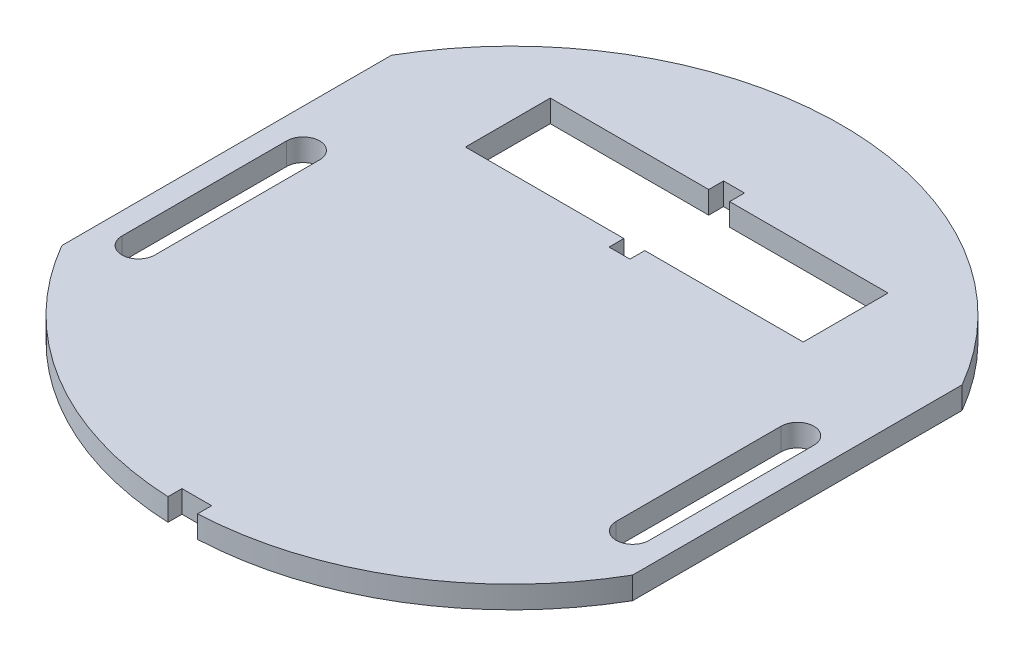
ISO-10303-21;
HEADER;
FILE_DESCRIPTION(('STEP AP214'),'2;1');
FILE_NAME('part.step','',(''),(''),'','','');
FILE_SCHEMA(('AUTOMOTIVE_DESIGN { 1 0 10303 214 1 1 1 1 }'));
ENDSEC;
DATA;
#1=APPLICATION_CONTEXT('core data for automotive mechanical design processes');
#2=APPLICATION_PROTOCOL_DEFINITION('international standard','automotive_design',2000,#1);
#3=PRODUCT_CONTEXT('',#1,'mechanical');
#4=PRODUCT('Part','Part','',(#3));
#5=PRODUCT_RELATED_PRODUCT_CATEGORY('part','',(#4));
#6=PRODUCT_DEFINITION_FORMATION('','',#4);
#7=PRODUCT_DEFINITION_CONTEXT('part definition',#1,'design');
#8=PRODUCT_DEFINITION('design','',#6,#7);
#9=PRODUCT_DEFINITION_SHAPE('','',#8);
#10=(LENGTH_UNIT() NAMED_UNIT(*) SI_UNIT(.MILLI.,.METRE.));
#11=(NAMED_UNIT(*) PLANE_ANGLE_UNIT() SI_UNIT($,.RADIAN.));
#12=(NAMED_UNIT(*) SI_UNIT($,.STERADIAN.) SOLID_ANGLE_UNIT());
#13=UNCERTAINTY_MEASURE_WITH_UNIT(LENGTH_MEASURE(1.E-05),#10,'distance_accuracy_value','');
#14=(GEOMETRIC_REPRESENTATION_CONTEXT(3) GLOBAL_UNCERTAINTY_ASSIGNED_CONTEXT((#13)) GLOBAL_UNIT_ASSIGNED_CONTEXT((#10,
#11,#12)) REPRESENTATION_CONTEXT('',''));
#15=CARTESIAN_POINT('',(0.,0.,0.));
#16=DIRECTION('',(0.,0.,1.));
#17=DIRECTION('',(1.,0.,0.));
#18=AXIS2_PLACEMENT_3D('',#15,#16,#17);
#19=CARTESIAN_POINT('',(0.,2.7,0.));
#20=DIRECTION('',(0.,-1.,0.));
#21=DIRECTION('',(0.,0.,-1.));
#22=AXIS2_PLACEMENT_3D('',#19,#20,#21);
#23=CYLINDRICAL_SURFACE('',#22,40.);
#24=DIRECTION('',(0.,-1.,0.));
#25=VECTOR('',#24,1.);
#26=CARTESIAN_POINT('',(1.79999999999999,138.405611065619,39.9594794760893));
#27=LINE('',#26,#25);
#28=CARTESIAN_POINT('',(1.79999999999999,2.7,39.9594794760893));
#29=VERTEX_POINT('',#28);
#30=CARTESIAN_POINT('',(1.79999999999999,0.,39.9594794760893));
#31=VERTEX_POINT('',#30);
#32=EDGE_CURVE('E240',#29,#31,#27,.T.);
#33=ORIENTED_EDGE('',*,*,#32,.T.);
#34=CARTESIAN_POINT('',(0.,0.,0.));
#35=DIRECTION('',(0.,1.,0.));
#36=DIRECTION('',(0.,0.,1.));
#37=AXIS2_PLACEMENT_3D('',#34,#35,#36);
#38=CIRCLE('',#37,40.);
#39=CARTESIAN_POINT('',(34.6410161513776,0.,19.9999999999999));
#40=VERTEX_POINT('',#39);
#41=EDGE_CURVE('E422',#31,#40,#38,.T.);
#42=ORIENTED_EDGE('',*,*,#41,.T.);
#43=DIRECTION('',(0.,-1.,0.));
#44=VECTOR('',#43,1.);
#45=CARTESIAN_POINT('',(34.6410161513776,2.7,19.9999999999999));
#46=LINE('',#45,#44);
#47=CARTESIAN_POINT('',(34.6410161513776,2.7,19.9999999999999));
#48=VERTEX_POINT('',#47);
#49=EDGE_CURVE('E428',#48,#40,#46,.T.);
#50=ORIENTED_EDGE('',*,*,#49,.F.);
#51=CARTESIAN_POINT('',(0.,2.7,0.));
#52=DIRECTION('',(0.,1.,0.));
#53=DIRECTION('',(0.,0.,1.));
#54=AXIS2_PLACEMENT_3D('',#51,#52,#53);
#55=CIRCLE('',#54,40.);
#56=EDGE_CURVE('E412',#29,#48,#55,.T.);
#57=ORIENTED_EDGE('',*,*,#56,.F.);
#58=EDGE_LOOP('',(#33,#42,#50,#57));
#59=FACE_BOUND('',#58,.T.);
#60=ADVANCED_FACE('F33',(#59),#23,.T.);
#61=DIRECTION('',(0.,-1.,0.));
#62=VECTOR('',#61,1.);
#63=CARTESIAN_POINT('',(-1.80000000000001,138.405611065619,39.9594794760893));
#64=LINE('',#63,#62);
#65=CARTESIAN_POINT('',(-1.80000000000001,2.7,39.9594794760893));
#66=VERTEX_POINT('',#65);
#67=CARTESIAN_POINT('',(-1.80000000000001,0.,39.9594794760893));
#68=VERTEX_POINT('',#67);
#69=EDGE_CURVE('E231',#66,#68,#64,.T.);
#70=ORIENTED_EDGE('',*,*,#69,.F.);
#71=CARTESIAN_POINT('',(-34.6410161513776,2.7,19.9999999999999));
#72=VERTEX_POINT('',#71);
#73=EDGE_CURVE('E413',#72,#66,#55,.T.);
#74=ORIENTED_EDGE('',*,*,#73,.F.);
#75=DIRECTION('',(0.,-1.,0.));
#76=VECTOR('',#75,1.);
#77=CARTESIAN_POINT('',(-34.6410161513776,2.7,19.9999999999999));
#78=LINE('',#77,#76);
#79=CARTESIAN_POINT('',(-34.6410161513776,0.,19.9999999999999));
#80=VERTEX_POINT('',#79);
#81=EDGE_CURVE('E431',#72,#80,#78,.T.);
#82=ORIENTED_EDGE('',*,*,#81,.T.);
#83=EDGE_CURVE('E423',#80,#68,#38,.T.);
#84=ORIENTED_EDGE('',*,*,#83,.T.);
#85=EDGE_LOOP('',(#70,#74,#82,#84));
#86=FACE_BOUND('',#85,.T.);
#87=ADVANCED_FACE('F445',(#86),#23,.T.);
#88=CARTESIAN_POINT('',(0.,2.7,0.));
#89=DIRECTION('',(0.,1.,0.));
#90=DIRECTION('',(0.,0.,1.));
#91=AXIS2_PLACEMENT_3D('',#88,#89,#90);
#92=PLANE('',#91);
#93=CARTESIAN_POINT('',(-30.,2.7,-4.65));
#94=DIRECTION('',(0.,1.,0.));
#95=DIRECTION('',(0.,0.,1.));
#96=AXIS2_PLACEMENT_3D('',#93,#94,#95);
#97=CIRCLE('',#96,2.);
#98=CARTESIAN_POINT('',(-28.,2.7,-4.65));
#99=VERTEX_POINT('',#98);
#100=CARTESIAN_POINT('',(-32.,2.7,-4.65));
#101=VERTEX_POINT('',#100);
#102=EDGE_CURVE('E382',#99,#101,#97,.T.);
#103=ORIENTED_EDGE('',*,*,#102,.F.);
#104=DIRECTION('',(0.,0.,-1.));
#105=VECTOR('',#104,1.);
#106=CARTESIAN_POINT('',(-28.,2.7,-4.65));
#107=LINE('',#106,#105);
#108=CARTESIAN_POINT('',(-28.,2.7,15.35));
#109=VERTEX_POINT('',#108);
#110=EDGE_CURVE('E390',#109,#99,#107,.T.);
#111=ORIENTED_EDGE('',*,*,#110,.F.);
#112=CARTESIAN_POINT('',(-30.,2.7,15.35));
#113=DIRECTION('',(0.,1.,0.));
#114=DIRECTION('',(0.,0.,1.));
#115=AXIS2_PLACEMENT_3D('',#112,#113,#114);
#116=CIRCLE('',#115,2.);
#117=CARTESIAN_POINT('',(-32.,2.7,15.35));
#118=VERTEX_POINT('',#117);
#119=EDGE_CURVE('E387',#118,#109,#116,.T.);
#120=ORIENTED_EDGE('',*,*,#119,.F.);
#121=DIRECTION('',(0.,0.,1.));
#122=VECTOR('',#121,1.);
#123=CARTESIAN_POINT('',(-32.,2.7,-4.65));
#124=LINE('',#123,#122);
#125=EDGE_CURVE('E384',#101,#118,#124,.T.);
#126=ORIENTED_EDGE('',*,*,#125,.F.);
#127=EDGE_LOOP('',(#103,#111,#120,#126));
#128=FACE_BOUND('',#127,.T.);
#129=DIRECTION('',(0.,0.,1.));
#130=VECTOR('',#129,1.);
#131=CARTESIAN_POINT('',(-1.27,2.7,-26.9499999999999));
#132=LINE('',#131,#130);
#133=CARTESIAN_POINT('',(-1.27,2.7,-26.9499999999999));
#134=VERTEX_POINT('',#133);
#135=CARTESIAN_POINT('',(-1.27,2.7,-25.1499999999999));
#136=VERTEX_POINT('',#135);
#137=EDGE_CURVE('E311',#134,#136,#132,.T.);
#138=ORIENTED_EDGE('',*,*,#137,.F.);
#139=DIRECTION('',(-1.,0.,0.));
#140=VECTOR('',#139,1.);
#141=CARTESIAN_POINT('',(-1.27,2.7,-26.9499999999999));
#142=LINE('',#141,#140);
#143=CARTESIAN_POINT('',(1.27,2.7,-26.9499999999999));
#144=VERTEX_POINT('',#143);
#145=EDGE_CURVE('E343',#144,#134,#142,.T.);
#146=ORIENTED_EDGE('',*,*,#145,.F.);
#147=DIRECTION('',(0.,0.,-1.));
#148=VECTOR('',#147,1.);
#149=CARTESIAN_POINT('',(1.27,2.7,-26.9499999999999));
#150=LINE('',#149,#148);
#151=CARTESIAN_POINT('',(1.27,2.7,-25.1499999999999));
#152=VERTEX_POINT('',#151);
#153=EDGE_CURVE('E340',#152,#144,#150,.T.);
#154=ORIENTED_EDGE('',*,*,#153,.F.);
#155=DIRECTION('',(-1.,0.,0.));
#156=VECTOR('',#155,1.);
#157=CARTESIAN_POINT('',(1.27,2.7,-25.1499999999999));
#158=LINE('',#157,#156);
#159=CARTESIAN_POINT('',(20.5,2.7,-25.1499999999999));
#160=VERTEX_POINT('',#159);
#161=EDGE_CURVE('E337',#160,#152,#158,.T.);
#162=ORIENTED_EDGE('',*,*,#161,.F.);
#163=DIRECTION('',(0.,0.,-1.));
#164=VECTOR('',#163,1.);
#165=CARTESIAN_POINT('',(20.5,2.7,-25.1499999999999));
#166=LINE('',#165,#164);
#167=CARTESIAN_POINT('',(20.5,2.7,-14.8499999999999));
#168=VERTEX_POINT('',#167);
#169=EDGE_CURVE('E334',#168,#160,#166,.T.);
#170=ORIENTED_EDGE('',*,*,#169,.F.);
#171=DIRECTION('',(1.,0.,0.));
#172=VECTOR('',#171,1.);
#173=CARTESIAN_POINT('',(1.27,2.7,-14.8499999999999));
#174=LINE('',#173,#172);
#175=CARTESIAN_POINT('',(1.27,2.7,-14.8499999999999));
#176=VERTEX_POINT('',#175);
#177=EDGE_CURVE('E331',#176,#168,#174,.T.);
#178=ORIENTED_EDGE('',*,*,#177,.F.);
#179=DIRECTION('',(0.,0.,-1.));
#180=VECTOR('',#179,1.);
#181=CARTESIAN_POINT('',(1.27,2.7,-14.8499999999999));
#182=LINE('',#181,#180);
#183=CARTESIAN_POINT('',(1.27,2.7,-13.0499999999999));
#184=VERTEX_POINT('',#183);
#185=EDGE_CURVE('E328',#184,#176,#182,.T.);
#186=ORIENTED_EDGE('',*,*,#185,.F.);
#187=DIRECTION('',(1.,0.,0.));
#188=VECTOR('',#187,1.);
#189=CARTESIAN_POINT('',(-1.27,2.7,-13.0499999999999));
#190=LINE('',#189,#188);
#191=CARTESIAN_POINT('',(-1.27,2.7,-13.0499999999999));
#192=VERTEX_POINT('',#191);
#193=EDGE_CURVE('E325',#192,#184,#190,.T.);
#194=ORIENTED_EDGE('',*,*,#193,.F.);
#195=DIRECTION('',(0.,0.,1.));
#196=VECTOR('',#195,1.);
#197=CARTESIAN_POINT('',(-1.27,2.7,-14.8499999999999));
#198=LINE('',#197,#196);
#199=CARTESIAN_POINT('',(-1.27,2.7,-14.8499999999999));
#200=VERTEX_POINT('',#199);
#201=EDGE_CURVE('E322',#200,#192,#198,.T.);
#202=ORIENTED_EDGE('',*,*,#201,.F.);
#203=DIRECTION('',(1.,0.,0.));
#204=VECTOR('',#203,1.);
#205=CARTESIAN_POINT('',(-20.5,2.7,-14.8499999999999));
#206=LINE('',#205,#204);
#207=CARTESIAN_POINT('',(-20.5,2.7,-14.8499999999999));
#208=VERTEX_POINT('',#207);
#209=EDGE_CURVE('E319',#208,#200,#206,.T.);
#210=ORIENTED_EDGE('',*,*,#209,.F.);
#211=DIRECTION('',(0.,0.,1.));
#212=VECTOR('',#211,1.);
#213=CARTESIAN_POINT('',(-20.5,2.7,-25.1499999999999));
#214=LINE('',#213,#212);
#215=CARTESIAN_POINT('',(-20.5,2.7,-25.1499999999999));
#216=VERTEX_POINT('',#215);
#217=EDGE_CURVE('E316',#216,#208,#214,.T.);
#218=ORIENTED_EDGE('',*,*,#217,.F.);
#219=DIRECTION('',(-1.,0.,0.));
#220=VECTOR('',#219,1.);
#221=CARTESIAN_POINT('',(-20.5,2.7,-25.1499999999999));
#222=LINE('',#221,#220);
#223=EDGE_CURVE('E313',#136,#216,#222,.T.);
#224=ORIENTED_EDGE('',*,*,#223,.F.);
#225=EDGE_LOOP('',(#138,#146,#154,#162,#170,#178,#186,#194,#202,#210,#218,#224));
#226=FACE_BOUND('',#225,.T.);
#227=CARTESIAN_POINT('',(30.,2.7,-4.65));
#228=DIRECTION('',(0.,-1.,0.));
#229=DIRECTION('',(0.,0.,1.));
#230=AXIS2_PLACEMENT_3D('',#227,#228,#229);
#231=CIRCLE('',#230,2.);
#232=CARTESIAN_POINT('',(28.,2.7,-4.65));
#233=VERTEX_POINT('',#232);
#234=CARTESIAN_POINT('',(32.,2.7,-4.65));
#235=VERTEX_POINT('',#234);
#236=EDGE_CURVE('E276',#233,#235,#231,.T.);
#237=ORIENTED_EDGE('',*,*,#236,.T.);
#238=DIRECTION('',(0.,0.,1.));
#239=VECTOR('',#238,1.);
#240=CARTESIAN_POINT('',(32.,2.7,-4.65));
#241=LINE('',#240,#239);
#242=CARTESIAN_POINT('',(32.,2.7,15.35));
#243=VERTEX_POINT('',#242);
#244=EDGE_CURVE('E249',#235,#243,#241,.T.);
#245=ORIENTED_EDGE('',*,*,#244,.T.);
#246=CARTESIAN_POINT('',(30.,2.7,15.35));
#247=DIRECTION('',(0.,-1.,0.));
#248=DIRECTION('',(0.,0.,1.));
#249=AXIS2_PLACEMENT_3D('',#246,#247,#248);
#250=CIRCLE('',#249,2.);
#251=CARTESIAN_POINT('',(28.,2.7,15.35));
#252=VERTEX_POINT('',#251);
#253=EDGE_CURVE('E260',#243,#252,#250,.T.);
#254=ORIENTED_EDGE('',*,*,#253,.T.);
#255=DIRECTION('',(0.,0.,-1.));
#256=VECTOR('',#255,1.);
#257=CARTESIAN_POINT('',(28.,2.7,-4.65));
#258=LINE('',#257,#256);
#259=EDGE_CURVE('E268',#252,#233,#258,.T.);
#260=ORIENTED_EDGE('',*,*,#259,.T.);
#261=EDGE_LOOP('',(#237,#245,#254,#260));
#262=FACE_BOUND('',#261,.T.);
#263=DIRECTION('',(1.,0.,0.));
#264=VECTOR('',#263,1.);
#265=CARTESIAN_POINT('',(0.,2.7,38.2594794760893));
#266=LINE('',#265,#264);
#267=CARTESIAN_POINT('',(-1.80000000000001,2.7,38.2594794760893));
#268=VERTEX_POINT('',#267);
#269=CARTESIAN_POINT('',(1.79999999999999,2.7,38.2594794760893));
#270=VERTEX_POINT('',#269);
#271=EDGE_CURVE('E48',#268,#270,#266,.T.);
#272=ORIENTED_EDGE('',*,*,#271,.T.);
#273=DIRECTION('',(0.,0.,1.));
#274=VECTOR('',#273,1.);
#275=CARTESIAN_POINT('',(1.79999999999998,2.7,0.));
#276=LINE('',#275,#274);
#277=EDGE_CURVE('E244',#270,#29,#276,.T.);
#278=ORIENTED_EDGE('',*,*,#277,.T.);
#279=ORIENTED_EDGE('',*,*,#56,.T.);
#280=DIRECTION('',(0.,0.,-1.));
#281=VECTOR('',#280,1.);
#282=CARTESIAN_POINT('',(34.6410161513776,2.7,-19.9999999999999));
#283=LINE('',#282,#281);
#284=CARTESIAN_POINT('',(34.6410161513776,2.7,-19.9999999999999));
#285=VERTEX_POINT('',#284);
#286=EDGE_CURVE('E415',#48,#285,#283,.T.);
#287=ORIENTED_EDGE('',*,*,#286,.T.);
#288=CARTESIAN_POINT('',(0.,2.7,0.));
#289=DIRECTION('',(0.,1.,0.));
#290=DIRECTION('',(0.,0.,1.));
#291=AXIS2_PLACEMENT_3D('',#288,#289,#290);
#292=CIRCLE('',#291,40.);
#293=CARTESIAN_POINT('',(-34.6410161513776,2.7,-19.9999999999999));
#294=VERTEX_POINT('',#293);
#295=EDGE_CURVE('E406',#285,#294,#292,.T.);
#296=ORIENTED_EDGE('',*,*,#295,.T.);
#297=DIRECTION('',(0.,0.,1.));
#298=VECTOR('',#297,1.);
#299=CARTESIAN_POINT('',(-34.6410161513776,2.7,-19.9999999999999));
#300=LINE('',#299,#298);
#301=EDGE_CURVE('E409',#294,#72,#300,.T.);
#302=ORIENTED_EDGE('',*,*,#301,.T.);
#303=ORIENTED_EDGE('',*,*,#73,.T.);
#304=DIRECTION('',(0.,0.,-1.));
#305=VECTOR('',#304,1.);
#306=CARTESIAN_POINT('',(-1.8,2.7,0.));
#307=LINE('',#306,#305);
#308=EDGE_CURVE('E53',#66,#268,#307,.T.);
#309=ORIENTED_EDGE('',*,*,#308,.T.);
#310=EDGE_LOOP('',(#272,#278,#279,#287,#296,#302,#303,#309));
#311=FACE_BOUND('',#310,.T.);
#312=ADVANCED_FACE('F447',(#128,#226,#262,#311),#92,.T.);
#313=CARTESIAN_POINT('',(0.,0.,0.));
#314=DIRECTION('',(0.,1.,0.));
#315=DIRECTION('',(0.,0.,1.));
#316=AXIS2_PLACEMENT_3D('',#313,#314,#315);
#317=PLANE('',#316);
#318=DIRECTION('',(0.,0.,1.));
#319=VECTOR('',#318,1.);
#320=CARTESIAN_POINT('',(-28.,0.,-4.65));
#321=LINE('',#320,#319);
#322=CARTESIAN_POINT('',(-28.,0.,-4.65));
#323=VERTEX_POINT('',#322);
#324=CARTESIAN_POINT('',(-28.,0.,15.35));
#325=VERTEX_POINT('',#324);
#326=EDGE_CURVE('E376',#323,#325,#321,.T.);
#327=ORIENTED_EDGE('',*,*,#326,.F.);
#328=CARTESIAN_POINT('',(-30.,0.,-4.65));
#329=DIRECTION('',(0.,1.,0.));
#330=DIRECTION('',(0.,0.,1.));
#331=AXIS2_PLACEMENT_3D('',#328,#329,#330);
#332=CIRCLE('',#331,2.);
#333=CARTESIAN_POINT('',(-32.,0.,-4.65));
#334=VERTEX_POINT('',#333);
#335=EDGE_CURVE('E379',#334,#323,#332,.F.);
#336=ORIENTED_EDGE('',*,*,#335,.F.);
#337=DIRECTION('',(0.,0.,-1.));
#338=VECTOR('',#337,1.);
#339=CARTESIAN_POINT('',(-32.,0.,-4.65));
#340=LINE('',#339,#338);
#341=CARTESIAN_POINT('',(-32.,0.,15.35));
#342=VERTEX_POINT('',#341);
#343=EDGE_CURVE('E396',#342,#334,#340,.T.);
#344=ORIENTED_EDGE('',*,*,#343,.F.);
#345=CARTESIAN_POINT('',(-30.,0.,15.35));
#346=DIRECTION('',(0.,1.,0.));
#347=DIRECTION('',(0.,0.,1.));
#348=AXIS2_PLACEMENT_3D('',#345,#346,#347);
#349=CIRCLE('',#348,2.);
#350=EDGE_CURVE('E374',#325,#342,#349,.F.);
#351=ORIENTED_EDGE('',*,*,#350,.F.);
#352=EDGE_LOOP('',(#327,#336,#344,#351));
#353=FACE_BOUND('',#352,.T.);
#354=DIRECTION('',(1.,0.,0.));
#355=VECTOR('',#354,1.);
#356=CARTESIAN_POINT('',(-1.27,0.,-26.9499999999999));
#357=LINE('',#356,#355);
#358=CARTESIAN_POINT('',(-1.27,0.,-26.9499999999999));
#359=VERTEX_POINT('',#358);
#360=CARTESIAN_POINT('',(1.27,0.,-26.9499999999999));
#361=VERTEX_POINT('',#360);
#362=EDGE_CURVE('E305',#359,#361,#357,.T.);
#363=ORIENTED_EDGE('',*,*,#362,.F.);
#364=DIRECTION('',(0.,0.,-1.));
#365=VECTOR('',#364,1.);
#366=CARTESIAN_POINT('',(-1.27,0.,-26.9499999999999));
#367=LINE('',#366,#365);
#368=CARTESIAN_POINT('',(-1.27,0.,-25.1499999999999));
#369=VERTEX_POINT('',#368);
#370=EDGE_CURVE('E308',#369,#359,#367,.T.);
#371=ORIENTED_EDGE('',*,*,#370,.F.);
#372=DIRECTION('',(1.,0.,0.));
#373=VECTOR('',#372,1.);
#374=CARTESIAN_POINT('',(-20.5,0.,-25.1499999999999));
#375=LINE('',#374,#373);
#376=CARTESIAN_POINT('',(-20.5,0.,-25.1499999999999));
#377=VERTEX_POINT('',#376);
#378=EDGE_CURVE('E349',#377,#369,#375,.T.);
#379=ORIENTED_EDGE('',*,*,#378,.F.);
#380=DIRECTION('',(0.,0.,-1.));
#381=VECTOR('',#380,1.);
#382=CARTESIAN_POINT('',(-20.5,0.,-25.1499999999999));
#383=LINE('',#382,#381);
#384=CARTESIAN_POINT('',(-20.5,0.,-14.8499999999999));
#385=VERTEX_POINT('',#384);
#386=EDGE_CURVE('E279',#385,#377,#383,.T.);
#387=ORIENTED_EDGE('',*,*,#386,.F.);
#388=DIRECTION('',(-1.,0.,0.));
#389=VECTOR('',#388,1.);
#390=CARTESIAN_POINT('',(-20.5,0.,-14.8499999999999));
#391=LINE('',#390,#389);
#392=CARTESIAN_POINT('',(-1.27,0.,-14.8499999999999));
#393=VERTEX_POINT('',#392);
#394=EDGE_CURVE('E281',#393,#385,#391,.T.);
#395=ORIENTED_EDGE('',*,*,#394,.F.);
#396=DIRECTION('',(0.,0.,-1.));
#397=VECTOR('',#396,1.);
#398=CARTESIAN_POINT('',(-1.27,0.,-14.8499999999999));
#399=LINE('',#398,#397);
#400=CARTESIAN_POINT('',(-1.27,0.,-13.0499999999999));
#401=VERTEX_POINT('',#400);
#402=EDGE_CURVE('E284',#401,#393,#399,.T.);
#403=ORIENTED_EDGE('',*,*,#402,.F.);
#404=DIRECTION('',(-1.,0.,0.));
#405=VECTOR('',#404,1.);
#406=CARTESIAN_POINT('',(-1.27,0.,-13.0499999999999));
#407=LINE('',#406,#405);
#408=CARTESIAN_POINT('',(1.27,0.,-13.0499999999999));
#409=VERTEX_POINT('',#408);
#410=EDGE_CURVE('E287',#409,#401,#407,.T.);
#411=ORIENTED_EDGE('',*,*,#410,.F.);
#412=DIRECTION('',(0.,0.,1.));
#413=VECTOR('',#412,1.);
#414=CARTESIAN_POINT('',(1.27,0.,-14.8499999999999));
#415=LINE('',#414,#413);
#416=CARTESIAN_POINT('',(1.27,0.,-14.8499999999999));
#417=VERTEX_POINT('',#416);
#418=EDGE_CURVE('E290',#417,#409,#415,.T.);
#419=ORIENTED_EDGE('',*,*,#418,.F.);
#420=DIRECTION('',(-1.,0.,0.));
#421=VECTOR('',#420,1.);
#422=CARTESIAN_POINT('',(1.27,0.,-14.8499999999999));
#423=LINE('',#422,#421);
#424=CARTESIAN_POINT('',(20.5,0.,-14.8499999999999));
#425=VERTEX_POINT('',#424);
#426=EDGE_CURVE('E293',#425,#417,#423,.T.);
#427=ORIENTED_EDGE('',*,*,#426,.F.);
#428=DIRECTION('',(0.,0.,1.));
#429=VECTOR('',#428,1.);
#430=CARTESIAN_POINT('',(20.5,0.,-25.1499999999999));
#431=LINE('',#430,#429);
#432=CARTESIAN_POINT('',(20.5,0.,-25.1499999999999));
#433=VERTEX_POINT('',#432);
#434=EDGE_CURVE('E296',#433,#425,#431,.T.);
#435=ORIENTED_EDGE('',*,*,#434,.F.);
#436=DIRECTION('',(1.,0.,0.));
#437=VECTOR('',#436,1.);
#438=CARTESIAN_POINT('',(1.27,0.,-25.1499999999999));
#439=LINE('',#438,#437);
#440=CARTESIAN_POINT('',(1.27,0.,-25.1499999999999));
#441=VERTEX_POINT('',#440);
#442=EDGE_CURVE('E299',#441,#433,#439,.T.);
#443=ORIENTED_EDGE('',*,*,#442,.F.);
#444=DIRECTION('',(0.,0.,1.));
#445=VECTOR('',#444,1.);
#446=CARTESIAN_POINT('',(1.27,0.,-26.9499999999999));
#447=LINE('',#446,#445);
#448=EDGE_CURVE('E302',#361,#441,#447,.T.);
#449=ORIENTED_EDGE('',*,*,#448,.F.);
#450=EDGE_LOOP('',(#363,#371,#379,#387,#395,#403,#411,#419,#427,#435,#443,#449));
#451=FACE_BOUND('',#450,.T.);
#452=DIRECTION('',(0.,0.,-1.));
#453=VECTOR('',#452,1.);
#454=CARTESIAN_POINT('',(32.,0.,-4.65));
#455=LINE('',#454,#453);
#456=CARTESIAN_POINT('',(32.,0.,15.35));
#457=VERTEX_POINT('',#456);
#458=CARTESIAN_POINT('',(32.,0.,-4.65));
#459=VERTEX_POINT('',#458);
#460=EDGE_CURVE('E246',#457,#459,#455,.T.);
#461=ORIENTED_EDGE('',*,*,#460,.T.);
#462=CARTESIAN_POINT('',(30.,0.,-4.65));
#463=DIRECTION('',(0.,-1.,0.));
#464=DIRECTION('',(0.,0.,1.));
#465=AXIS2_PLACEMENT_3D('',#462,#463,#464);
#466=CIRCLE('',#465,2.);
#467=CARTESIAN_POINT('',(28.,0.,-4.65));
#468=VERTEX_POINT('',#467);
#469=EDGE_CURVE('E273',#459,#468,#466,.F.);
#470=ORIENTED_EDGE('',*,*,#469,.T.);
#471=DIRECTION('',(0.,0.,1.));
#472=VECTOR('',#471,1.);
#473=CARTESIAN_POINT('',(28.,0.,-4.65));
#474=LINE('',#473,#472);
#475=CARTESIAN_POINT('',(28.,0.,15.35));
#476=VERTEX_POINT('',#475);
#477=EDGE_CURVE('E265',#468,#476,#474,.T.);
#478=ORIENTED_EDGE('',*,*,#477,.T.);
#479=CARTESIAN_POINT('',(30.,0.,15.35));
#480=DIRECTION('',(0.,-1.,0.));
#481=DIRECTION('',(0.,0.,1.));
#482=AXIS2_PLACEMENT_3D('',#479,#480,#481);
#483=CIRCLE('',#482,2.);
#484=EDGE_CURVE('E257',#476,#457,#483,.F.);
#485=ORIENTED_EDGE('',*,*,#484,.T.);
#486=EDGE_LOOP('',(#461,#470,#478,#485));
#487=FACE_BOUND('',#486,.T.);
#488=DIRECTION('',(0.,0.,1.));
#489=VECTOR('',#488,1.);
#490=CARTESIAN_POINT('',(1.79999999999998,0.,0.));
#491=LINE('',#490,#489);
#492=CARTESIAN_POINT('',(1.79999999999999,0.,38.2594794760893));
#493=VERTEX_POINT('',#492);
#494=EDGE_CURVE('E11',#493,#31,#491,.T.);
#495=ORIENTED_EDGE('',*,*,#494,.F.);
#496=DIRECTION('',(1.,0.,0.));
#497=VECTOR('',#496,1.);
#498=CARTESIAN_POINT('',(0.,0.,38.2594794760893));
#499=LINE('',#498,#497);
#500=CARTESIAN_POINT('',(-1.80000000000001,0.,38.2594794760893));
#501=VERTEX_POINT('',#500);
#502=EDGE_CURVE('E41',#501,#493,#499,.T.);
#503=ORIENTED_EDGE('',*,*,#502,.F.);
#504=DIRECTION('',(0.,0.,-1.));
#505=VECTOR('',#504,1.);
#506=CARTESIAN_POINT('',(-1.8,0.,0.));
#507=LINE('',#506,#505);
#508=EDGE_CURVE('E219',#68,#501,#507,.T.);
#509=ORIENTED_EDGE('',*,*,#508,.F.);
#510=ORIENTED_EDGE('',*,*,#83,.F.);
#511=DIRECTION('',(0.,0.,1.));
#512=VECTOR('',#511,1.);
#513=CARTESIAN_POINT('',(-34.6410161513776,0.,-19.9999999999999));
#514=LINE('',#513,#512);
#515=CARTESIAN_POINT('',(-34.6410161513776,0.,-19.9999999999999));
#516=VERTEX_POINT('',#515);
#517=EDGE_CURVE('E420',#516,#80,#514,.T.);
#518=ORIENTED_EDGE('',*,*,#517,.F.);
#519=CARTESIAN_POINT('',(0.,0.,0.));
#520=DIRECTION('',(0.,1.,0.));
#521=DIRECTION('',(0.,0.,1.));
#522=AXIS2_PLACEMENT_3D('',#519,#520,#521);
#523=CIRCLE('',#522,40.);
#524=CARTESIAN_POINT('',(34.6410161513776,0.,-19.9999999999999));
#525=VERTEX_POINT('',#524);
#526=EDGE_CURVE('E405',#525,#516,#523,.T.);
#527=ORIENTED_EDGE('',*,*,#526,.F.);
#528=DIRECTION('',(0.,0.,-1.));
#529=VECTOR('',#528,1.);
#530=CARTESIAN_POINT('',(34.6410161513776,0.,-19.9999999999999));
#531=LINE('',#530,#529);
#532=EDGE_CURVE('E410',#40,#525,#531,.T.);
#533=ORIENTED_EDGE('',*,*,#532,.F.);
#534=ORIENTED_EDGE('',*,*,#41,.F.);
#535=EDGE_LOOP('',(#495,#503,#509,#510,#518,#527,#533,#534));
#536=FACE_BOUND('',#535,.T.);
#537=ADVANCED_FACE('F217',(#353,#451,#487,#536),#317,.F.);
#538=CARTESIAN_POINT('',(0.,2.7,0.));
#539=DIRECTION('',(0.,-1.,0.));
#540=DIRECTION('',(0.,0.,-1.));
#541=AXIS2_PLACEMENT_3D('',#538,#539,#540);
#542=CYLINDRICAL_SURFACE('',#541,40.);
#543=ORIENTED_EDGE('',*,*,#526,.T.);
#544=DIRECTION('',(0.,-1.,0.));
#545=VECTOR('',#544,1.);
#546=CARTESIAN_POINT('',(-34.6410161513776,2.7,-19.9999999999999));
#547=LINE('',#546,#545);
#548=EDGE_CURVE('E232',#294,#516,#547,.T.);
#549=ORIENTED_EDGE('',*,*,#548,.F.);
#550=ORIENTED_EDGE('',*,*,#295,.F.);
#551=DIRECTION('',(0.,-1.,0.));
#552=VECTOR('',#551,1.);
#553=CARTESIAN_POINT('',(34.6410161513776,2.7,-19.9999999999999));
#554=LINE('',#553,#552);
#555=EDGE_CURVE('E417',#285,#525,#554,.T.);
#556=ORIENTED_EDGE('',*,*,#555,.T.);
#557=EDGE_LOOP('',(#543,#549,#550,#556));
#558=FACE_BOUND('',#557,.T.);
#559=ADVANCED_FACE('F35',(#558),#542,.T.);
#560=CARTESIAN_POINT('',(-34.6410161513776,2.7,-19.9999999999999));
#561=DIRECTION('',(1.,0.,0.));
#562=DIRECTION('',(0.,0.,-1.));
#563=AXIS2_PLACEMENT_3D('',#560,#561,#562);
#564=PLANE('',#563);
#565=ORIENTED_EDGE('',*,*,#517,.T.);
#566=ORIENTED_EDGE('',*,*,#81,.F.);
#567=ORIENTED_EDGE('',*,*,#301,.F.);
#568=ORIENTED_EDGE('',*,*,#548,.T.);
#569=EDGE_LOOP('',(#565,#566,#567,#568));
#570=FACE_BOUND('',#569,.T.);
#571=ADVANCED_FACE('F437',(#570),#564,.F.);
#572=CARTESIAN_POINT('',(34.6410161513776,2.7,-19.9999999999999));
#573=DIRECTION('',(-1.,0.,0.));
#574=DIRECTION('',(0.,0.,1.));
#575=AXIS2_PLACEMENT_3D('',#572,#573,#574);
#576=PLANE('',#575);
#577=ORIENTED_EDGE('',*,*,#532,.T.);
#578=ORIENTED_EDGE('',*,*,#555,.F.);
#579=ORIENTED_EDGE('',*,*,#286,.F.);
#580=ORIENTED_EDGE('',*,*,#49,.T.);
#581=EDGE_LOOP('',(#577,#578,#579,#580));
#582=FACE_BOUND('',#581,.T.);
#583=ADVANCED_FACE('F452',(#582),#576,.F.);
#584=CARTESIAN_POINT('',(-30.,-0.00100000000000013,-4.65));
#585=DIRECTION('',(0.,1.,0.));
#586=DIRECTION('',(0.,0.,1.));
#587=AXIS2_PLACEMENT_3D('',#584,#585,#586);
#588=CYLINDRICAL_SURFACE('',#587,2.);
#589=ORIENTED_EDGE('',*,*,#335,.T.);
#590=DIRECTION('',(0.,1.,0.));
#591=VECTOR('',#590,1.);
#592=CARTESIAN_POINT('',(-28.,-0.00100000000000013,-4.65));
#593=LINE('',#592,#591);
#594=EDGE_CURVE('E394',#323,#99,#593,.T.);
#595=ORIENTED_EDGE('',*,*,#594,.T.);
#596=ORIENTED_EDGE('',*,*,#102,.T.);
#597=DIRECTION('',(0.,1.,0.));
#598=VECTOR('',#597,1.);
#599=CARTESIAN_POINT('',(-32.,-0.00100000000000013,-4.65));
#600=LINE('',#599,#598);
#601=EDGE_CURVE('E393',#334,#101,#600,.T.);
#602=ORIENTED_EDGE('',*,*,#601,.F.);
#603=EDGE_LOOP('',(#589,#595,#596,#602));
#604=FACE_BOUND('',#603,.T.);
#605=ADVANCED_FACE('F480',(#604),#588,.F.);
#606=CARTESIAN_POINT('',(-28.,-0.00100000000000013,-4.65));
#607=DIRECTION('',(1.,0.,0.));
#608=DIRECTION('',(0.,0.,-1.));
#609=AXIS2_PLACEMENT_3D('',#606,#607,#608);
#610=PLANE('',#609);
#611=ORIENTED_EDGE('',*,*,#326,.T.);
#612=DIRECTION('',(0.,1.,0.));
#613=VECTOR('',#612,1.);
#614=CARTESIAN_POINT('',(-28.,-0.00100000000000013,15.35));
#615=LINE('',#614,#613);
#616=EDGE_CURVE('E397',#325,#109,#615,.T.);
#617=ORIENTED_EDGE('',*,*,#616,.T.);
#618=ORIENTED_EDGE('',*,*,#110,.T.);
#619=ORIENTED_EDGE('',*,*,#594,.F.);
#620=EDGE_LOOP('',(#611,#617,#618,#619));
#621=FACE_BOUND('',#620,.T.);
#622=ADVANCED_FACE('F495',(#621),#610,.F.);
#623=CARTESIAN_POINT('',(-30.,-0.00100000000000013,15.35));
#624=DIRECTION('',(0.,1.,0.));
#625=DIRECTION('',(0.,0.,1.));
#626=AXIS2_PLACEMENT_3D('',#623,#624,#625);
#627=CYLINDRICAL_SURFACE('',#626,2.);
#628=ORIENTED_EDGE('',*,*,#350,.T.);
#629=DIRECTION('',(0.,1.,0.));
#630=VECTOR('',#629,1.);
#631=CARTESIAN_POINT('',(-32.,-0.00100000000000013,15.35));
#632=LINE('',#631,#630);
#633=EDGE_CURVE('E399',#342,#118,#632,.T.);
#634=ORIENTED_EDGE('',*,*,#633,.T.);
#635=ORIENTED_EDGE('',*,*,#119,.T.);
#636=ORIENTED_EDGE('',*,*,#616,.F.);
#637=EDGE_LOOP('',(#628,#634,#635,#636));
#638=FACE_BOUND('',#637,.T.);
#639=ADVANCED_FACE('F501',(#638),#627,.F.);
#640=CARTESIAN_POINT('',(-32.,-0.00100000000000013,-4.65));
#641=DIRECTION('',(-1.,0.,0.));
#642=DIRECTION('',(0.,0.,1.));
#643=AXIS2_PLACEMENT_3D('',#640,#641,#642);
#644=PLANE('',#643);
#645=ORIENTED_EDGE('',*,*,#343,.T.);
#646=ORIENTED_EDGE('',*,*,#601,.T.);
#647=ORIENTED_EDGE('',*,*,#125,.T.);
#648=ORIENTED_EDGE('',*,*,#633,.F.);
#649=EDGE_LOOP('',(#645,#646,#647,#648));
#650=FACE_BOUND('',#649,.T.);
#651=ADVANCED_FACE('F497',(#650),#644,.F.);
#652=CARTESIAN_POINT('',(-1.27,-0.00100000000000013,-26.9499999999999));
#653=DIRECTION('',(-1.,0.,0.));
#654=DIRECTION('',(0.,0.,1.));
#655=AXIS2_PLACEMENT_3D('',#652,#653,#654);
#656=PLANE('',#655);
#657=ORIENTED_EDGE('',*,*,#370,.T.);
#658=DIRECTION('',(0.,1.,0.));
#659=VECTOR('',#658,1.);
#660=CARTESIAN_POINT('',(-1.27,-0.00100000000000013,-26.9499999999999));
#661=LINE('',#660,#659);
#662=EDGE_CURVE('E347',#359,#134,#661,.T.);
#663=ORIENTED_EDGE('',*,*,#662,.T.);
#664=ORIENTED_EDGE('',*,*,#137,.T.);
#665=DIRECTION('',(0.,1.,0.));
#666=VECTOR('',#665,1.);
#667=CARTESIAN_POINT('',(-1.27,-0.00100000000000013,-25.1499999999999));
#668=LINE('',#667,#666);
#669=EDGE_CURVE('E346',#369,#136,#668,.T.);
#670=ORIENTED_EDGE('',*,*,#669,.F.);
#671=EDGE_LOOP('',(#657,#663,#664,#670));
#672=FACE_BOUND('',#671,.T.);
#673=ADVANCED_FACE('F500',(#672),#656,.F.);
#674=CARTESIAN_POINT('',(-1.27,-0.00100000000000013,-26.9499999999999));
#675=DIRECTION('',(0.,0.,-1.));
#676=DIRECTION('',(-1.,0.,0.));
#677=AXIS2_PLACEMENT_3D('',#674,#675,#676);
#678=PLANE('',#677);
#679=ORIENTED_EDGE('',*,*,#362,.T.);
#680=DIRECTION('',(0.,1.,0.));
#681=VECTOR('',#680,1.);
#682=CARTESIAN_POINT('',(1.27,-0.00100000000000013,-26.9499999999999));
#683=LINE('',#682,#681);
#684=EDGE_CURVE('E350',#361,#144,#683,.T.);
#685=ORIENTED_EDGE('',*,*,#684,.T.);
#686=ORIENTED_EDGE('',*,*,#145,.T.);
#687=ORIENTED_EDGE('',*,*,#662,.F.);
#688=EDGE_LOOP('',(#679,#685,#686,#687));
#689=FACE_BOUND('',#688,.T.);
#690=ADVANCED_FACE('F511',(#689),#678,.F.);
#691=CARTESIAN_POINT('',(1.27,-0.00100000000000013,-26.9499999999999));
#692=DIRECTION('',(1.,0.,0.));
#693=DIRECTION('',(0.,0.,-1.));
#694=AXIS2_PLACEMENT_3D('',#691,#692,#693);
#695=PLANE('',#694);
#696=ORIENTED_EDGE('',*,*,#448,.T.);
#697=DIRECTION('',(0.,1.,0.));
#698=VECTOR('',#697,1.);
#699=CARTESIAN_POINT('',(1.27,-0.00100000000000013,-25.1499999999999));
#700=LINE('',#699,#698);
#701=EDGE_CURVE('E352',#441,#152,#700,.T.);
#702=ORIENTED_EDGE('',*,*,#701,.T.);
#703=ORIENTED_EDGE('',*,*,#153,.T.);
#704=ORIENTED_EDGE('',*,*,#684,.F.);
#705=EDGE_LOOP('',(#696,#702,#703,#704));
#706=FACE_BOUND('',#705,.T.);
#707=ADVANCED_FACE('F549',(#706),#695,.F.);
#708=CARTESIAN_POINT('',(1.27,-0.00100000000000013,-25.1499999999999));
#709=DIRECTION('',(0.,0.,-1.));
#710=DIRECTION('',(-1.,0.,0.));
#711=AXIS2_PLACEMENT_3D('',#708,#709,#710);
#712=PLANE('',#711);
#713=ORIENTED_EDGE('',*,*,#442,.T.);
#714=DIRECTION('',(0.,1.,0.));
#715=VECTOR('',#714,1.);
#716=CARTESIAN_POINT('',(20.5,-0.00100000000000013,-25.1499999999999));
#717=LINE('',#716,#715);
#718=EDGE_CURVE('E354',#433,#160,#717,.T.);
#719=ORIENTED_EDGE('',*,*,#718,.T.);
#720=ORIENTED_EDGE('',*,*,#161,.T.);
#721=ORIENTED_EDGE('',*,*,#701,.F.);
#722=EDGE_LOOP('',(#713,#719,#720,#721));
#723=FACE_BOUND('',#722,.T.);
#724=ADVANCED_FACE('F545',(#723),#712,.F.);
#725=CARTESIAN_POINT('',(20.5,-0.00100000000000013,-25.1499999999999));
#726=DIRECTION('',(1.,0.,0.));
#727=DIRECTION('',(0.,0.,-1.));
#728=AXIS2_PLACEMENT_3D('',#725,#726,#727);
#729=PLANE('',#728);
#730=ORIENTED_EDGE('',*,*,#434,.T.);
#731=DIRECTION('',(0.,1.,0.));
#732=VECTOR('',#731,1.);
#733=CARTESIAN_POINT('',(20.5,-0.00100000000000013,-14.8499999999999));
#734=LINE('',#733,#732);
#735=EDGE_CURVE('E356',#425,#168,#734,.T.);
#736=ORIENTED_EDGE('',*,*,#735,.T.);
#737=ORIENTED_EDGE('',*,*,#169,.T.);
#738=ORIENTED_EDGE('',*,*,#718,.F.);
#739=EDGE_LOOP('',(#730,#736,#737,#738));
#740=FACE_BOUND('',#739,.T.);
#741=ADVANCED_FACE('F541',(#740),#729,.F.);
#742=CARTESIAN_POINT('',(1.27,-0.00100000000000013,-14.8499999999999));
#743=DIRECTION('',(0.,0.,1.));
#744=DIRECTION('',(1.,0.,0.));
#745=AXIS2_PLACEMENT_3D('',#742,#743,#744);
#746=PLANE('',#745);
#747=ORIENTED_EDGE('',*,*,#426,.T.);
#748=DIRECTION('',(0.,1.,0.));
#749=VECTOR('',#748,1.);
#750=CARTESIAN_POINT('',(1.27,-0.00100000000000013,-14.8499999999999));
#751=LINE('',#750,#749);
#752=EDGE_CURVE('E358',#417,#176,#751,.T.);
#753=ORIENTED_EDGE('',*,*,#752,.T.);
#754=ORIENTED_EDGE('',*,*,#177,.T.);
#755=ORIENTED_EDGE('',*,*,#735,.F.);
#756=EDGE_LOOP('',(#747,#753,#754,#755));
#757=FACE_BOUND('',#756,.T.);
#758=ADVANCED_FACE('F537',(#757),#746,.F.);
#759=CARTESIAN_POINT('',(1.27,-0.00100000000000013,-14.8499999999999));
#760=DIRECTION('',(1.,0.,0.));
#761=DIRECTION('',(0.,0.,-1.));
#762=AXIS2_PLACEMENT_3D('',#759,#760,#761);
#763=PLANE('',#762);
#764=ORIENTED_EDGE('',*,*,#418,.T.);
#765=DIRECTION('',(0.,1.,0.));
#766=VECTOR('',#765,1.);
#767=CARTESIAN_POINT('',(1.27,-0.00100000000000013,-13.0499999999999));
#768=LINE('',#767,#766);
#769=EDGE_CURVE('E360',#409,#184,#768,.T.);
#770=ORIENTED_EDGE('',*,*,#769,.T.);
#771=ORIENTED_EDGE('',*,*,#185,.T.);
#772=ORIENTED_EDGE('',*,*,#752,.F.);
#773=EDGE_LOOP('',(#764,#770,#771,#772));
#774=FACE_BOUND('',#773,.T.);
#775=ADVANCED_FACE('F533',(#774),#763,.F.);
#776=CARTESIAN_POINT('',(-1.27,-0.00100000000000013,-13.0499999999999));
#777=DIRECTION('',(0.,0.,1.));
#778=DIRECTION('',(1.,0.,0.));
#779=AXIS2_PLACEMENT_3D('',#776,#777,#778);
#780=PLANE('',#779);
#781=ORIENTED_EDGE('',*,*,#410,.T.);
#782=DIRECTION('',(0.,1.,0.));
#783=VECTOR('',#782,1.);
#784=CARTESIAN_POINT('',(-1.27,-0.00100000000000013,-13.0499999999999));
#785=LINE('',#784,#783);
#786=EDGE_CURVE('E362',#401,#192,#785,.T.);
#787=ORIENTED_EDGE('',*,*,#786,.T.);
#788=ORIENTED_EDGE('',*,*,#193,.T.);
#789=ORIENTED_EDGE('',*,*,#769,.F.);
#790=EDGE_LOOP('',(#781,#787,#788,#789));
#791=FACE_BOUND('',#790,.T.);
#792=ADVANCED_FACE('F529',(#791),#780,.F.);
#793=CARTESIAN_POINT('',(-1.27,-0.00100000000000013,-14.8499999999999));
#794=DIRECTION('',(-1.,0.,0.));
#795=DIRECTION('',(0.,0.,1.));
#796=AXIS2_PLACEMENT_3D('',#793,#794,#795);
#797=PLANE('',#796);
#798=ORIENTED_EDGE('',*,*,#402,.T.);
#799=DIRECTION('',(0.,1.,0.));
#800=VECTOR('',#799,1.);
#801=CARTESIAN_POINT('',(-1.27,-0.00100000000000013,-14.8499999999999));
#802=LINE('',#801,#800);
#803=EDGE_CURVE('E364',#393,#200,#802,.T.);
#804=ORIENTED_EDGE('',*,*,#803,.T.);
#805=ORIENTED_EDGE('',*,*,#201,.T.);
#806=ORIENTED_EDGE('',*,*,#786,.F.);
#807=EDGE_LOOP('',(#798,#804,#805,#806));
#808=FACE_BOUND('',#807,.T.);
#809=ADVANCED_FACE('F525',(#808),#797,.F.);
#810=CARTESIAN_POINT('',(-20.5,-0.00100000000000013,-14.8499999999999));
#811=DIRECTION('',(0.,0.,1.));
#812=DIRECTION('',(1.,0.,0.));
#813=AXIS2_PLACEMENT_3D('',#810,#811,#812);
#814=PLANE('',#813);
#815=ORIENTED_EDGE('',*,*,#394,.T.);
#816=DIRECTION('',(0.,1.,0.));
#817=VECTOR('',#816,1.);
#818=CARTESIAN_POINT('',(-20.5,-0.00100000000000013,-14.8499999999999));
#819=LINE('',#818,#817);
#820=EDGE_CURVE('E366',#385,#208,#819,.T.);
#821=ORIENTED_EDGE('',*,*,#820,.T.);
#822=ORIENTED_EDGE('',*,*,#209,.T.);
#823=ORIENTED_EDGE('',*,*,#803,.F.);
#824=EDGE_LOOP('',(#815,#821,#822,#823));
#825=FACE_BOUND('',#824,.T.);
#826=ADVANCED_FACE('F521',(#825),#814,.F.);
#827=CARTESIAN_POINT('',(-20.5,-0.00100000000000013,-25.1499999999999));
#828=DIRECTION('',(-1.,0.,0.));
#829=DIRECTION('',(0.,0.,1.));
#830=AXIS2_PLACEMENT_3D('',#827,#828,#829);
#831=PLANE('',#830);
#832=ORIENTED_EDGE('',*,*,#386,.T.);
#833=DIRECTION('',(0.,1.,0.));
#834=VECTOR('',#833,1.);
#835=CARTESIAN_POINT('',(-20.5,-0.00100000000000013,-25.1499999999999));
#836=LINE('',#835,#834);
#837=EDGE_CURVE('E368',#377,#216,#836,.T.);
#838=ORIENTED_EDGE('',*,*,#837,.T.);
#839=ORIENTED_EDGE('',*,*,#217,.T.);
#840=ORIENTED_EDGE('',*,*,#820,.F.);
#841=EDGE_LOOP('',(#832,#838,#839,#840));
#842=FACE_BOUND('',#841,.T.);
#843=ADVANCED_FACE('F517',(#842),#831,.F.);
#844=CARTESIAN_POINT('',(-20.5,-0.00100000000000013,-25.1499999999999));
#845=DIRECTION('',(0.,0.,-1.));
#846=DIRECTION('',(-1.,0.,0.));
#847=AXIS2_PLACEMENT_3D('',#844,#845,#846);
#848=PLANE('',#847);
#849=ORIENTED_EDGE('',*,*,#378,.T.);
#850=ORIENTED_EDGE('',*,*,#669,.T.);
#851=ORIENTED_EDGE('',*,*,#223,.T.);
#852=ORIENTED_EDGE('',*,*,#837,.F.);
#853=EDGE_LOOP('',(#849,#850,#851,#852));
#854=FACE_BOUND('',#853,.T.);
#855=ADVANCED_FACE('F513',(#854),#848,.F.);
#856=CARTESIAN_POINT('',(30.,-0.00100000000000013,-4.65));
#857=DIRECTION('',(0.,1.,0.));
#858=DIRECTION('',(0.,0.,1.));
#859=AXIS2_PLACEMENT_3D('',#856,#857,#858);
#860=CYLINDRICAL_SURFACE('',#859,2.);
#861=ORIENTED_EDGE('',*,*,#469,.F.);
#862=DIRECTION('',(0.,1.,0.));
#863=VECTOR('',#862,1.);
#864=CARTESIAN_POINT('',(32.,-0.00100000000000013,-4.65));
#865=LINE('',#864,#863);
#866=EDGE_CURVE('E252',#459,#235,#865,.T.);
#867=ORIENTED_EDGE('',*,*,#866,.T.);
#868=ORIENTED_EDGE('',*,*,#236,.F.);
#869=DIRECTION('',(0.,1.,0.));
#870=VECTOR('',#869,1.);
#871=CARTESIAN_POINT('',(28.,-0.00100000000000013,-4.65));
#872=LINE('',#871,#870);
#873=EDGE_CURVE('E271',#468,#233,#872,.T.);
#874=ORIENTED_EDGE('',*,*,#873,.F.);
#875=EDGE_LOOP('',(#861,#867,#868,#874));
#876=FACE_BOUND('',#875,.T.);
#877=ADVANCED_FACE('F516',(#876),#860,.F.);
#878=CARTESIAN_POINT('',(28.,-0.00100000000000013,-4.65));
#879=DIRECTION('',(-1.,0.,0.));
#880=DIRECTION('',(0.,0.,-1.));
#881=AXIS2_PLACEMENT_3D('',#878,#879,#880);
#882=PLANE('',#881);
#883=ORIENTED_EDGE('',*,*,#477,.F.);
#884=ORIENTED_EDGE('',*,*,#873,.T.);
#885=ORIENTED_EDGE('',*,*,#259,.F.);
#886=DIRECTION('',(0.,1.,0.));
#887=VECTOR('',#886,1.);
#888=CARTESIAN_POINT('',(28.,-0.00100000000000013,15.35));
#889=LINE('',#888,#887);
#890=EDGE_CURVE('E263',#476,#252,#889,.T.);
#891=ORIENTED_EDGE('',*,*,#890,.F.);
#892=EDGE_LOOP('',(#883,#884,#885,#891));
#893=FACE_BOUND('',#892,.T.);
#894=ADVANCED_FACE('F559',(#893),#882,.F.);
#895=CARTESIAN_POINT('',(30.,-0.00100000000000013,15.35));
#896=DIRECTION('',(0.,1.,0.));
#897=DIRECTION('',(0.,0.,1.));
#898=AXIS2_PLACEMENT_3D('',#895,#896,#897);
#899=CYLINDRICAL_SURFACE('',#898,2.);
#900=ORIENTED_EDGE('',*,*,#484,.F.);
#901=ORIENTED_EDGE('',*,*,#890,.T.);
#902=ORIENTED_EDGE('',*,*,#253,.F.);
#903=DIRECTION('',(0.,1.,0.));
#904=VECTOR('',#903,1.);
#905=CARTESIAN_POINT('',(32.,-0.00100000000000013,15.35));
#906=LINE('',#905,#904);
#907=EDGE_CURVE('E254',#457,#243,#906,.T.);
#908=ORIENTED_EDGE('',*,*,#907,.F.);
#909=EDGE_LOOP('',(#900,#901,#902,#908));
#910=FACE_BOUND('',#909,.T.);
#911=ADVANCED_FACE('F465',(#910),#899,.F.);
#912=CARTESIAN_POINT('',(32.,-0.00100000000000013,-4.65));
#913=DIRECTION('',(1.,0.,0.));
#914=DIRECTION('',(0.,0.,1.));
#915=AXIS2_PLACEMENT_3D('',#912,#913,#914);
#916=PLANE('',#915);
#917=ORIENTED_EDGE('',*,*,#460,.F.);
#918=ORIENTED_EDGE('',*,*,#907,.T.);
#919=ORIENTED_EDGE('',*,*,#244,.F.);
#920=ORIENTED_EDGE('',*,*,#866,.F.);
#921=EDGE_LOOP('',(#917,#918,#919,#920));
#922=FACE_BOUND('',#921,.T.);
#923=ADVANCED_FACE('F458',(#922),#916,.F.);
#924=CARTESIAN_POINT('',(1.79999999999999,138.405611065619,39.9594794760893));
#925=DIRECTION('',(-1.,0.,0.));
#926=DIRECTION('',(0.,0.,1.));
#927=AXIS2_PLACEMENT_3D('',#924,#925,#926);
#928=PLANE('',#927);
#929=ORIENTED_EDGE('',*,*,#277,.F.);
#930=DIRECTION('',(0.,-1.,0.));
#931=VECTOR('',#930,1.);
#932=CARTESIAN_POINT('',(1.79999999999999,138.405611065619,38.2594794760893));
#933=LINE('',#932,#931);
#934=EDGE_CURVE('E236',#270,#493,#933,.T.);
#935=ORIENTED_EDGE('',*,*,#934,.T.);
#936=ORIENTED_EDGE('',*,*,#494,.T.);
#937=ORIENTED_EDGE('',*,*,#32,.F.);
#938=EDGE_LOOP('',(#929,#935,#936,#937));
#939=FACE_BOUND('',#938,.T.);
#940=ADVANCED_FACE('F456',(#939),#928,.T.);
#941=CARTESIAN_POINT('',(1.79999999999999,138.405611065619,38.2594794760893));
#942=DIRECTION('',(0.,0.,1.));
#943=DIRECTION('',(1.,0.,0.));
#944=AXIS2_PLACEMENT_3D('',#941,#942,#943);
#945=PLANE('',#944);
#946=ORIENTED_EDGE('',*,*,#271,.F.);
#947=DIRECTION('',(0.,-1.,0.));
#948=VECTOR('',#947,1.);
#949=CARTESIAN_POINT('',(-1.80000000000001,138.405611065619,38.2594794760893));
#950=LINE('',#949,#948);
#951=EDGE_CURVE('E230',#268,#501,#950,.T.);
#952=ORIENTED_EDGE('',*,*,#951,.T.);
#953=ORIENTED_EDGE('',*,*,#502,.T.);
#954=ORIENTED_EDGE('',*,*,#934,.F.);
#955=EDGE_LOOP('',(#946,#952,#953,#954));
#956=FACE_BOUND('',#955,.T.);
#957=ADVANCED_FACE('F234',(#956),#945,.T.);
#958=CARTESIAN_POINT('',(-1.80000000000001,138.405611065619,38.2594794760893));
#959=DIRECTION('',(1.,0.,0.));
#960=DIRECTION('',(0.,0.,-1.));
#961=AXIS2_PLACEMENT_3D('',#958,#959,#960);
#962=PLANE('',#961);
#963=ORIENTED_EDGE('',*,*,#308,.F.);
#964=ORIENTED_EDGE('',*,*,#69,.T.);
#965=ORIENTED_EDGE('',*,*,#508,.T.);
#966=ORIENTED_EDGE('',*,*,#951,.F.);
#967=EDGE_LOOP('',(#963,#964,#965,#966));
#968=FACE_BOUND('',#967,.T.);
#969=ADVANCED_FACE('F229',(#968),#962,.T.);
#970=CLOSED_SHELL('',(#60,#87,#312,#537,#559,#571,#583,#605,#622,#639,#651,#673,#690,#707,#724,
#741,#758,#775,#792,#809,#826,#843,#855,#877,#894,#911,#923,#940,#957,#969));
#971=MANIFOLD_SOLID_BREP('B2',#970);
#972=ADVANCED_BREP_SHAPE_REPRESENTATION('',(#18,#971),#14);
#973=SHAPE_DEFINITION_REPRESENTATION(#9,#972);
ENDSEC;
END-ISO-10303-21;
